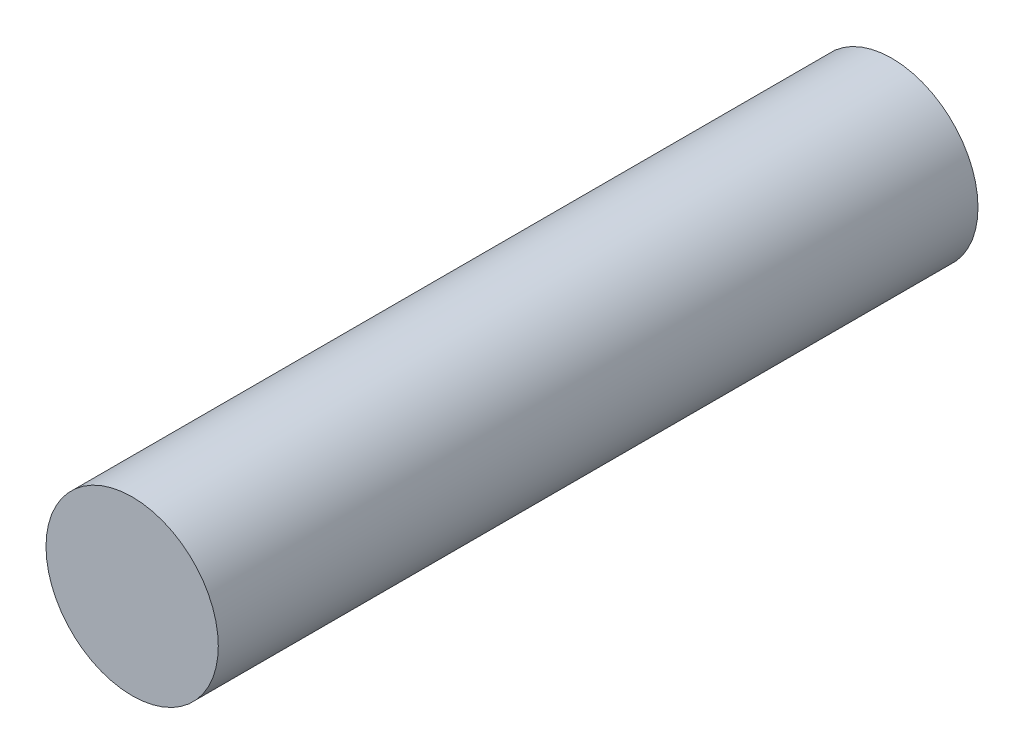
ISO-10303-21;
HEADER;
FILE_DESCRIPTION(('STEP AP214'),'2;1');
FILE_NAME('part.step','',(''),(''),'','','');
FILE_SCHEMA(('AUTOMOTIVE_DESIGN { 1 0 10303 214 1 1 1 1 }'));
ENDSEC;
DATA;
#1=APPLICATION_CONTEXT('core data for automotive mechanical design processes');
#2=APPLICATION_PROTOCOL_DEFINITION('international standard','automotive_design',2000,#1);
#3=PRODUCT_CONTEXT('',#1,'mechanical');
#4=PRODUCT('Part','Part','',(#3));
#5=PRODUCT_RELATED_PRODUCT_CATEGORY('part','',(#4));
#6=PRODUCT_DEFINITION_FORMATION('','',#4);
#7=PRODUCT_DEFINITION_CONTEXT('part definition',#1,'design');
#8=PRODUCT_DEFINITION('design','',#6,#7);
#9=PRODUCT_DEFINITION_SHAPE('','',#8);
#10=(LENGTH_UNIT() NAMED_UNIT(*) SI_UNIT(.MILLI.,.METRE.));
#11=(NAMED_UNIT(*) PLANE_ANGLE_UNIT() SI_UNIT($,.RADIAN.));
#12=(NAMED_UNIT(*) SI_UNIT($,.STERADIAN.) SOLID_ANGLE_UNIT());
#13=UNCERTAINTY_MEASURE_WITH_UNIT(LENGTH_MEASURE(1.E-05),#10,'distance_accuracy_value','');
#14=(GEOMETRIC_REPRESENTATION_CONTEXT(3) GLOBAL_UNCERTAINTY_ASSIGNED_CONTEXT((#13)) GLOBAL_UNIT_ASSIGNED_CONTEXT((#10,
#11,#12)) REPRESENTATION_CONTEXT('',''));
#15=CARTESIAN_POINT('',(0.,0.,0.));
#16=DIRECTION('',(0.,0.,1.));
#17=DIRECTION('',(1.,0.,0.));
#18=AXIS2_PLACEMENT_3D('',#15,#16,#17);
#19=CARTESIAN_POINT('',(0.,0.,48.5));
#20=DIRECTION('',(0.,0.,-1.));
#21=DIRECTION('',(-1.,0.,0.));
#22=AXIS2_PLACEMENT_3D('',#19,#20,#21);
#23=CYLINDRICAL_SURFACE('',#22,5.5);
#24=CARTESIAN_POINT('',(0.,0.,48.5));
#25=DIRECTION('',(0.,0.,1.));
#26=DIRECTION('',(1.,0.,0.));
#27=AXIS2_PLACEMENT_3D('',#24,#25,#26);
#28=CIRCLE('',#27,5.5);
#29=CARTESIAN_POINT('',(-5.5,0.,48.5));
#30=VERTEX_POINT('',#29);
#31=EDGE_CURVE('E10',#30,#30,#28,.T.);
#32=CARTESIAN_POINT('',(0.,0.,0.));
#33=DIRECTION('',(0.,0.,1.));
#34=DIRECTION('',(1.,0.,0.));
#35=AXIS2_PLACEMENT_3D('',#32,#33,#34);
#36=CIRCLE('',#35,5.5);
#37=CARTESIAN_POINT('',(-5.5,0.,0.));
#38=VERTEX_POINT('',#37);
#39=EDGE_CURVE('E40',#38,#38,#36,.T.);
#40=CARTESIAN_POINT('',(-5.5,0.,48.5));
#41=CARTESIAN_POINT('',(-5.5,0.,47.9947916666667));
#42=CARTESIAN_POINT('',(-5.5,0.,47.4895833333333));
#43=CARTESIAN_POINT('',(-5.5,0.,46.4791666666667));
#44=CARTESIAN_POINT('',(-5.5,0.,45.9739583333333));
#45=CARTESIAN_POINT('',(-5.5,0.,44.9635416666667));
#46=CARTESIAN_POINT('',(-5.5,0.,44.4583333333333));
#47=CARTESIAN_POINT('',(-5.5,0.,43.4479166666667));
#48=CARTESIAN_POINT('',(-5.5,0.,42.9427083333333));
#49=CARTESIAN_POINT('',(-5.5,0.,41.9322916666667));
#50=CARTESIAN_POINT('',(-5.5,0.,41.4270833333333));
#51=CARTESIAN_POINT('',(-5.5,0.,40.4166666666667));
#52=CARTESIAN_POINT('',(-5.5,0.,39.9114583333333));
#53=CARTESIAN_POINT('',(-5.5,0.,38.9010416666667));
#54=CARTESIAN_POINT('',(-5.5,0.,38.3958333333333));
#55=CARTESIAN_POINT('',(-5.5,0.,37.3854166666667));
#56=CARTESIAN_POINT('',(-5.5,0.,36.8802083333333));
#57=CARTESIAN_POINT('',(-5.5,0.,35.8697916666667));
#58=CARTESIAN_POINT('',(-5.5,0.,35.3645833333333));
#59=CARTESIAN_POINT('',(-5.5,0.,34.3541666666667));
#60=CARTESIAN_POINT('',(-5.5,0.,33.8489583333333));
#61=CARTESIAN_POINT('',(-5.5,0.,32.8385416666667));
#62=CARTESIAN_POINT('',(-5.5,0.,32.3333333333333));
#63=CARTESIAN_POINT('',(-5.5,0.,31.3229166666667));
#64=CARTESIAN_POINT('',(-5.5,0.,30.8177083333333));
#65=CARTESIAN_POINT('',(-5.5,0.,29.8072916666667));
#66=CARTESIAN_POINT('',(-5.5,0.,29.3020833333333));
#67=CARTESIAN_POINT('',(-5.5,0.,28.2916666666667));
#68=CARTESIAN_POINT('',(-5.5,0.,27.7864583333333));
#69=CARTESIAN_POINT('',(-5.5,0.,26.7760416666667));
#70=CARTESIAN_POINT('',(-5.5,0.,26.2708333333333));
#71=CARTESIAN_POINT('',(-5.5,0.,25.2604166666667));
#72=CARTESIAN_POINT('',(-5.5,0.,24.7552083333333));
#73=CARTESIAN_POINT('',(-5.5,0.,23.7447916666667));
#74=CARTESIAN_POINT('',(-5.5,0.,23.2395833333333));
#75=CARTESIAN_POINT('',(-5.5,0.,22.2291666666667));
#76=CARTESIAN_POINT('',(-5.5,0.,21.7239583333333));
#77=CARTESIAN_POINT('',(-5.5,0.,20.7135416666667));
#78=CARTESIAN_POINT('',(-5.5,0.,20.2083333333333));
#79=CARTESIAN_POINT('',(-5.5,0.,19.1979166666667));
#80=CARTESIAN_POINT('',(-5.5,0.,18.6927083333333));
#81=CARTESIAN_POINT('',(-5.5,0.,17.6822916666667));
#82=CARTESIAN_POINT('',(-5.5,0.,17.1770833333333));
#83=CARTESIAN_POINT('',(-5.5,0.,16.1666666666667));
#84=CARTESIAN_POINT('',(-5.5,0.,15.6614583333333));
#85=CARTESIAN_POINT('',(-5.5,0.,14.6510416666667));
#86=CARTESIAN_POINT('',(-5.5,0.,14.1458333333333));
#87=CARTESIAN_POINT('',(-5.5,0.,13.1354166666667));
#88=CARTESIAN_POINT('',(-5.5,0.,12.6302083333333));
#89=CARTESIAN_POINT('',(-5.5,0.,11.6197916666667));
#90=CARTESIAN_POINT('',(-5.5,0.,11.1145833333333));
#91=CARTESIAN_POINT('',(-5.5,0.,10.1041666666667));
#92=CARTESIAN_POINT('',(-5.5,0.,9.59895833333333));
#93=CARTESIAN_POINT('',(-5.5,0.,8.58854166666666));
#94=CARTESIAN_POINT('',(-5.5,0.,8.08333333333333));
#95=CARTESIAN_POINT('',(-5.5,0.,7.07291666666666));
#96=CARTESIAN_POINT('',(-5.5,0.,6.56770833333333));
#97=CARTESIAN_POINT('',(-5.5,0.,5.55729166666666));
#98=CARTESIAN_POINT('',(-5.5,0.,5.05208333333333));
#99=CARTESIAN_POINT('',(-5.5,0.,4.04166666666666));
#100=CARTESIAN_POINT('',(-5.5,0.,3.53645833333333));
#101=CARTESIAN_POINT('',(-5.5,0.,2.52604166666666));
#102=CARTESIAN_POINT('',(-5.5,0.,2.02083333333333));
#103=CARTESIAN_POINT('',(-5.5,0.,1.01041666666666));
#104=CARTESIAN_POINT('',(-5.5,0.,0.505208333333326));
#105=CARTESIAN_POINT('',(-5.5,0.,0.));
#106=B_SPLINE_CURVE_WITH_KNOTS('',3,(#40,#41,#42,#43,#44,#45,#46,#47,#48,#49,#50,#51,#52,#53,
#54,#55,#56,#57,#58,#59,#60,#61,#62,#63,#64,#65,#66,#67,#68,#69,#70,#71,#72,#73,#74,#75,#76,#77,
#78,#79,#80,#81,#82,#83,#84,#85,#86,#87,#88,#89,#90,#91,#92,#93,#94,#95,#96,#97,#98,#99,#100,
#101,#102,#103,#104,#105),.UNSPECIFIED.,.F.,.F.,(4,2,2,2,2,2,2,2,2,2,2,2,2,2,2,2,2,2,2,2,2,2,2,
2,2,2,2,2,2,2,2,2,4),(0.,1.51562500000001,3.03125000000001,4.54687500000001,6.06250000000001,
7.57812500000001,9.09375000000001,10.609375,12.125,13.640625,15.15625,16.671875,18.1875,
19.703125,21.21875,22.734375,24.25,25.765625,27.28125,28.796875,30.3125,31.828125,33.34375,
34.859375,36.375,37.890625,39.40625,40.921875,42.4375,43.953125,45.46875,46.984375,48.5),.UNSPECIFIED.);
#107=EDGE_CURVE('BSEAM37',#30,#38,#106,.T.);
#108=ORIENTED_EDGE('',*,*,#31,.F.);
#109=ORIENTED_EDGE('',*,*,#39,.T.);
#110=ORIENTED_EDGE('',*,*,#107,.T.);
#111=ORIENTED_EDGE('',*,*,#107,.F.);
#112=EDGE_LOOP('',(#108,#110,#109,#111));
#113=FACE_BOUND('',#112,.T.);
#114=ADVANCED_FACE('F37',(#113),#23,.T.);
#115=CARTESIAN_POINT('',(0.,0.,48.5));
#116=DIRECTION('',(0.,0.,1.));
#117=DIRECTION('',(1.,0.,0.));
#118=AXIS2_PLACEMENT_3D('',#115,#116,#117);
#119=PLANE('',#118);
#120=ORIENTED_EDGE('',*,*,#31,.T.);
#121=EDGE_LOOP('',(#120));
#122=FACE_BOUND('',#121,.T.);
#123=ADVANCED_FACE('F54',(#122),#119,.T.);
#124=CARTESIAN_POINT('',(0.,0.,0.));
#125=DIRECTION('',(0.,0.,1.));
#126=DIRECTION('',(1.,0.,0.));
#127=AXIS2_PLACEMENT_3D('',#124,#125,#126);
#128=PLANE('',#127);
#129=ORIENTED_EDGE('',*,*,#39,.F.);
#130=EDGE_LOOP('',(#129));
#131=FACE_BOUND('',#130,.T.);
#132=ADVANCED_FACE('F52',(#131),#128,.F.);
#133=CLOSED_SHELL('',(#114,#123,#132));
#134=MANIFOLD_SOLID_BREP('B2',#133);
#135=ADVANCED_BREP_SHAPE_REPRESENTATION('',(#18,#134),#14);
#136=SHAPE_DEFINITION_REPRESENTATION(#9,#135);
ENDSEC;
END-ISO-10303-21;
